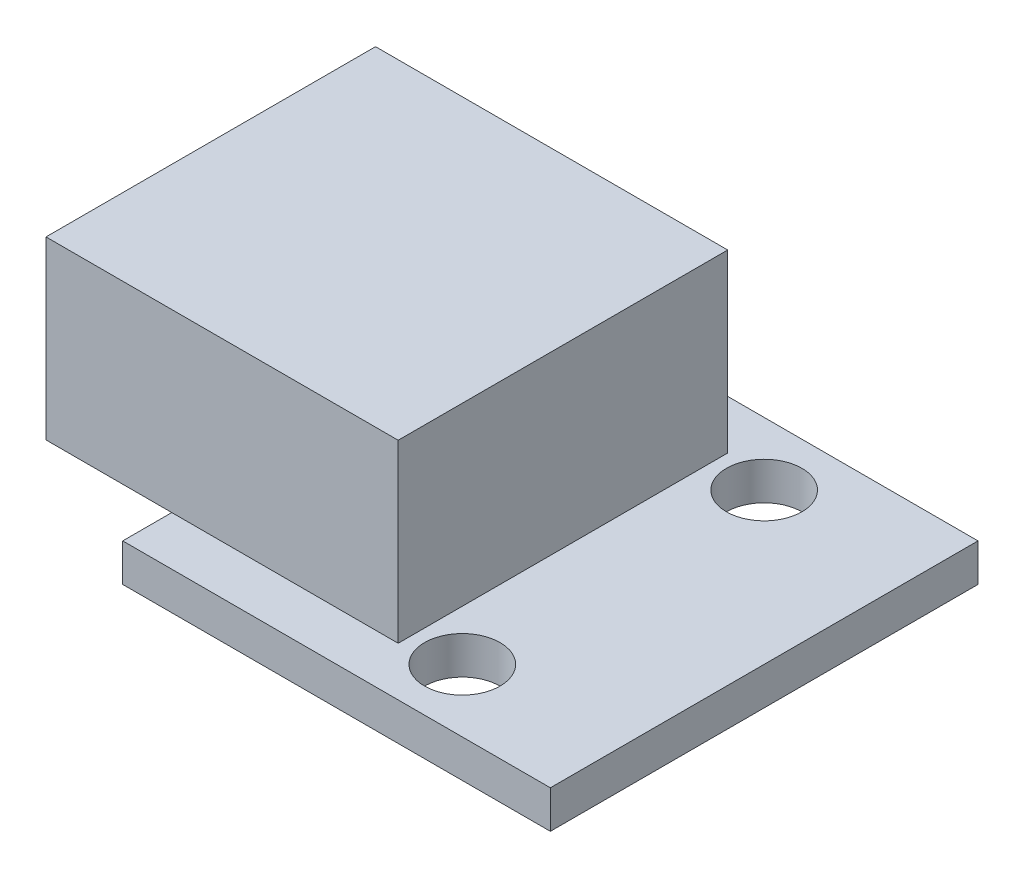
ISO-10303-21;
HEADER;
FILE_DESCRIPTION(('STEP AP214'),'2;1');
FILE_NAME('part.step','',(''),(''),'','','');
FILE_SCHEMA(('AUTOMOTIVE_DESIGN { 1 0 10303 214 1 1 1 1 }'));
ENDSEC;
DATA;
#1=APPLICATION_CONTEXT('core data for automotive mechanical design processes');
#2=APPLICATION_PROTOCOL_DEFINITION('international standard','automotive_design',2000,#1);
#3=PRODUCT_CONTEXT('',#1,'mechanical');
#4=PRODUCT('Part','Part','',(#3));
#5=PRODUCT_RELATED_PRODUCT_CATEGORY('part','',(#4));
#6=PRODUCT_DEFINITION_FORMATION('','',#4);
#7=PRODUCT_DEFINITION_CONTEXT('part definition',#1,'design');
#8=PRODUCT_DEFINITION('design','',#6,#7);
#9=PRODUCT_DEFINITION_SHAPE('','',#8);
#10=(LENGTH_UNIT() NAMED_UNIT(*) SI_UNIT(.MILLI.,.METRE.));
#11=(NAMED_UNIT(*) PLANE_ANGLE_UNIT() SI_UNIT($,.RADIAN.));
#12=(NAMED_UNIT(*) SI_UNIT($,.STERADIAN.) SOLID_ANGLE_UNIT());
#13=UNCERTAINTY_MEASURE_WITH_UNIT(LENGTH_MEASURE(1.E-05),#10,'distance_accuracy_value','');
#14=(GEOMETRIC_REPRESENTATION_CONTEXT(3) GLOBAL_UNCERTAINTY_ASSIGNED_CONTEXT((#13)) GLOBAL_UNIT_ASSIGNED_CONTEXT((#10,
#11,#12)) REPRESENTATION_CONTEXT('',''));
#15=CARTESIAN_POINT('',(0.,0.,0.));
#16=DIRECTION('',(0.,0.,1.));
#17=DIRECTION('',(1.,0.,0.));
#18=AXIS2_PLACEMENT_3D('',#15,#16,#17);
#19=CARTESIAN_POINT('',(0.,1.5,0.));
#20=DIRECTION('',(0.,-1.,0.));
#21=DIRECTION('',(0.,0.,-1.));
#22=AXIS2_PLACEMENT_3D('',#19,#20,#21);
#23=PLANE('',#22);
#24=CARTESIAN_POINT('',(2.5,1.5,6.));
#25=DIRECTION('',(0.,1.,0.));
#26=DIRECTION('',(0.,0.,1.));
#27=AXIS2_PLACEMENT_3D('',#24,#25,#26);
#28=CIRCLE('',#27,1.5);
#29=CARTESIAN_POINT('',(2.5,1.5,7.5));
#30=VERTEX_POINT('',#29);
#31=EDGE_CURVE('E126',#30,#30,#28,.T.);
#32=ORIENTED_EDGE('',*,*,#31,.F.);
#33=EDGE_LOOP('',(#32));
#34=FACE_BOUND('',#33,.T.);
#35=CARTESIAN_POINT('',(2.5,1.5,-6.));
#36=DIRECTION('',(0.,1.,0.));
#37=DIRECTION('',(0.,0.,1.));
#38=AXIS2_PLACEMENT_3D('',#35,#36,#37);
#39=CIRCLE('',#38,1.5);
#40=CARTESIAN_POINT('',(2.5,1.5,-4.5));
#41=VERTEX_POINT('',#40);
#42=EDGE_CURVE('E135',#41,#41,#39,.T.);
#43=ORIENTED_EDGE('',*,*,#42,.F.);
#44=EDGE_LOOP('',(#43));
#45=FACE_BOUND('',#44,.T.);
#46=DIRECTION('',(1.,0.,0.));
#47=VECTOR('',#46,1.);
#48=CARTESIAN_POINT('',(-13.5,1.5,6.55));
#49=LINE('',#48,#47);
#50=CARTESIAN_POINT('',(-8.5,1.5,6.55));
#51=VERTEX_POINT('',#50);
#52=CARTESIAN_POINT('',(0.500000000000002,1.5,6.55));
#53=VERTEX_POINT('',#52);
#54=EDGE_CURVE('E11',#51,#53,#49,.T.);
#55=ORIENTED_EDGE('',*,*,#54,.F.);
#56=DIRECTION('',(0.,0.,1.));
#57=VECTOR('',#56,1.);
#58=CARTESIAN_POINT('',(-8.5,1.5,8.5));
#59=LINE('',#58,#57);
#60=CARTESIAN_POINT('',(-8.5,1.5,8.5));
#61=VERTEX_POINT('',#60);
#62=EDGE_CURVE('E147',#51,#61,#59,.T.);
#63=ORIENTED_EDGE('',*,*,#62,.T.);
#64=DIRECTION('',(1.,0.,0.));
#65=VECTOR('',#64,1.);
#66=CARTESIAN_POINT('',(-8.5,1.5,8.5));
#67=LINE('',#66,#65);
#68=CARTESIAN_POINT('',(8.5,1.5,8.5));
#69=VERTEX_POINT('',#68);
#70=EDGE_CURVE('E150',#61,#69,#67,.T.);
#71=ORIENTED_EDGE('',*,*,#70,.T.);
#72=DIRECTION('',(0.,0.,-1.));
#73=VECTOR('',#72,1.);
#74=CARTESIAN_POINT('',(8.5,1.5,8.5));
#75=LINE('',#74,#73);
#76=CARTESIAN_POINT('',(8.5,1.5,-8.5));
#77=VERTEX_POINT('',#76);
#78=EDGE_CURVE('E141',#69,#77,#75,.T.);
#79=ORIENTED_EDGE('',*,*,#78,.T.);
#80=DIRECTION('',(-1.,0.,0.));
#81=VECTOR('',#80,1.);
#82=CARTESIAN_POINT('',(-8.5,1.5,-8.5));
#83=LINE('',#82,#81);
#84=CARTESIAN_POINT('',(-8.5,1.5,-8.5));
#85=VERTEX_POINT('',#84);
#86=EDGE_CURVE('E144',#77,#85,#83,.T.);
#87=ORIENTED_EDGE('',*,*,#86,.T.);
#88=CARTESIAN_POINT('',(-8.5,1.5,-6.55));
#89=VERTEX_POINT('',#88);
#90=EDGE_CURVE('E148',#85,#89,#59,.T.);
#91=ORIENTED_EDGE('',*,*,#90,.T.);
#92=DIRECTION('',(-1.,0.,0.));
#93=VECTOR('',#92,1.);
#94=CARTESIAN_POINT('',(-13.5,1.5,-6.55));
#95=LINE('',#94,#93);
#96=CARTESIAN_POINT('',(0.500000000000002,1.5,-6.55));
#97=VERTEX_POINT('',#96);
#98=EDGE_CURVE('E53',#97,#89,#95,.T.);
#99=ORIENTED_EDGE('',*,*,#98,.F.);
#100=DIRECTION('',(0.,0.,-1.));
#101=VECTOR('',#100,1.);
#102=CARTESIAN_POINT('',(0.500000000000002,1.5,6.55));
#103=LINE('',#102,#101);
#104=EDGE_CURVE('E49',#53,#97,#103,.T.);
#105=ORIENTED_EDGE('',*,*,#104,.F.);
#106=EDGE_LOOP('',(#55,#63,#71,#79,#87,#91,#99,#105));
#107=FACE_BOUND('',#106,.T.);
#108=ADVANCED_FACE('F32',(#34,#45,#107),#23,.F.);
#109=CARTESIAN_POINT('',(0.,0.,0.));
#110=DIRECTION('',(0.,-1.,0.));
#111=DIRECTION('',(0.,0.,-1.));
#112=AXIS2_PLACEMENT_3D('',#109,#110,#111);
#113=PLANE('',#112);
#114=CARTESIAN_POINT('',(2.5,0.,-6.));
#115=DIRECTION('',(0.,1.,0.));
#116=DIRECTION('',(0.,0.,1.));
#117=AXIS2_PLACEMENT_3D('',#114,#115,#116);
#118=CIRCLE('',#117,1.5);
#119=CARTESIAN_POINT('',(2.5,0.,-4.5));
#120=VERTEX_POINT('',#119);
#121=EDGE_CURVE('E133',#120,#120,#118,.T.);
#122=ORIENTED_EDGE('',*,*,#121,.T.);
#123=EDGE_LOOP('',(#122));
#124=FACE_BOUND('',#123,.T.);
#125=DIRECTION('',(0.,0.,-1.));
#126=VECTOR('',#125,1.);
#127=CARTESIAN_POINT('',(8.5,0.,8.5));
#128=LINE('',#127,#126);
#129=CARTESIAN_POINT('',(8.5,0.,8.5));
#130=VERTEX_POINT('',#129);
#131=CARTESIAN_POINT('',(8.5,0.,-8.5));
#132=VERTEX_POINT('',#131);
#133=EDGE_CURVE('E138',#130,#132,#128,.T.);
#134=ORIENTED_EDGE('',*,*,#133,.F.);
#135=DIRECTION('',(1.,0.,0.));
#136=VECTOR('',#135,1.);
#137=CARTESIAN_POINT('',(-8.5,0.,8.5));
#138=LINE('',#137,#136);
#139=CARTESIAN_POINT('',(-8.5,0.,8.5));
#140=VERTEX_POINT('',#139);
#141=EDGE_CURVE('E145',#140,#130,#138,.T.);
#142=ORIENTED_EDGE('',*,*,#141,.F.);
#143=DIRECTION('',(0.,0.,1.));
#144=VECTOR('',#143,1.);
#145=CARTESIAN_POINT('',(-8.5,0.,8.5));
#146=LINE('',#145,#144);
#147=CARTESIAN_POINT('',(-8.5,0.,-8.5));
#148=VERTEX_POINT('',#147);
#149=EDGE_CURVE('E158',#148,#140,#146,.T.);
#150=ORIENTED_EDGE('',*,*,#149,.F.);
#151=DIRECTION('',(-1.,0.,0.));
#152=VECTOR('',#151,1.);
#153=CARTESIAN_POINT('',(-8.5,0.,-8.5));
#154=LINE('',#153,#152);
#155=EDGE_CURVE('E156',#132,#148,#154,.T.);
#156=ORIENTED_EDGE('',*,*,#155,.F.);
#157=EDGE_LOOP('',(#134,#142,#150,#156));
#158=FACE_BOUND('',#157,.T.);
#159=CARTESIAN_POINT('',(2.5,0.,6.));
#160=DIRECTION('',(0.,1.,0.));
#161=DIRECTION('',(0.,0.,1.));
#162=AXIS2_PLACEMENT_3D('',#159,#160,#161);
#163=CIRCLE('',#162,1.5);
#164=CARTESIAN_POINT('',(2.5,0.,7.5));
#165=VERTEX_POINT('',#164);
#166=EDGE_CURVE('E123',#165,#165,#163,.T.);
#167=ORIENTED_EDGE('',*,*,#166,.T.);
#168=EDGE_LOOP('',(#167));
#169=FACE_BOUND('',#168,.T.);
#170=ADVANCED_FACE('F181',(#124,#158,#169),#113,.T.);
#171=CARTESIAN_POINT('',(8.5,1.5,8.5));
#172=DIRECTION('',(-1.,0.,0.));
#173=DIRECTION('',(0.,0.,1.));
#174=AXIS2_PLACEMENT_3D('',#171,#172,#173);
#175=PLANE('',#174);
#176=ORIENTED_EDGE('',*,*,#133,.T.);
#177=DIRECTION('',(0.,-1.,0.));
#178=VECTOR('',#177,1.);
#179=CARTESIAN_POINT('',(8.5,1.5,-8.5));
#180=LINE('',#179,#178);
#181=EDGE_CURVE('E36',#77,#132,#180,.T.);
#182=ORIENTED_EDGE('',*,*,#181,.F.);
#183=ORIENTED_EDGE('',*,*,#78,.F.);
#184=DIRECTION('',(0.,-1.,0.));
#185=VECTOR('',#184,1.);
#186=CARTESIAN_POINT('',(8.5,1.5,8.5));
#187=LINE('',#186,#185);
#188=EDGE_CURVE('E153',#69,#130,#187,.T.);
#189=ORIENTED_EDGE('',*,*,#188,.T.);
#190=EDGE_LOOP('',(#176,#182,#183,#189));
#191=FACE_BOUND('',#190,.T.);
#192=ADVANCED_FACE('F34',(#191),#175,.F.);
#193=CARTESIAN_POINT('',(-8.5,1.5,-8.5));
#194=DIRECTION('',(0.,0.,1.));
#195=DIRECTION('',(1.,0.,0.));
#196=AXIS2_PLACEMENT_3D('',#193,#194,#195);
#197=PLANE('',#196);
#198=ORIENTED_EDGE('',*,*,#155,.T.);
#199=DIRECTION('',(0.,-1.,0.));
#200=VECTOR('',#199,1.);
#201=CARTESIAN_POINT('',(-8.5,1.5,-8.5));
#202=LINE('',#201,#200);
#203=EDGE_CURVE('E165',#85,#148,#202,.T.);
#204=ORIENTED_EDGE('',*,*,#203,.F.);
#205=ORIENTED_EDGE('',*,*,#86,.F.);
#206=ORIENTED_EDGE('',*,*,#181,.T.);
#207=EDGE_LOOP('',(#198,#204,#205,#206));
#208=FACE_BOUND('',#207,.T.);
#209=ADVANCED_FACE('F174',(#208),#197,.F.);
#210=CARTESIAN_POINT('',(-8.5,1.5,8.5));
#211=DIRECTION('',(1.,0.,0.));
#212=DIRECTION('',(0.,0.,-1.));
#213=AXIS2_PLACEMENT_3D('',#210,#211,#212);
#214=PLANE('',#213);
#215=ORIENTED_EDGE('',*,*,#149,.T.);
#216=DIRECTION('',(0.,-1.,0.));
#217=VECTOR('',#216,1.);
#218=CARTESIAN_POINT('',(-8.5,1.5,8.5));
#219=LINE('',#218,#217);
#220=EDGE_CURVE('E163',#61,#140,#219,.T.);
#221=ORIENTED_EDGE('',*,*,#220,.F.);
#222=ORIENTED_EDGE('',*,*,#62,.F.);
#223=EDGE_CURVE('E151',#89,#51,#59,.T.);
#224=ORIENTED_EDGE('',*,*,#223,.F.);
#225=ORIENTED_EDGE('',*,*,#90,.F.);
#226=ORIENTED_EDGE('',*,*,#203,.T.);
#227=EDGE_LOOP('',(#215,#221,#222,#224,#225,#226));
#228=FACE_BOUND('',#227,.T.);
#229=ADVANCED_FACE('F184',(#228),#214,.F.);
#230=CARTESIAN_POINT('',(-8.5,1.5,8.5));
#231=DIRECTION('',(0.,0.,-1.));
#232=DIRECTION('',(-1.,0.,0.));
#233=AXIS2_PLACEMENT_3D('',#230,#231,#232);
#234=PLANE('',#233);
#235=ORIENTED_EDGE('',*,*,#141,.T.);
#236=ORIENTED_EDGE('',*,*,#188,.F.);
#237=ORIENTED_EDGE('',*,*,#70,.F.);
#238=ORIENTED_EDGE('',*,*,#220,.T.);
#239=EDGE_LOOP('',(#235,#236,#237,#238));
#240=FACE_BOUND('',#239,.T.);
#241=ADVANCED_FACE('F188',(#240),#234,.F.);
#242=CARTESIAN_POINT('',(2.5,1.5,-6.));
#243=DIRECTION('',(0.,-1.,0.));
#244=DIRECTION('',(0.,0.,-1.));
#245=AXIS2_PLACEMENT_3D('',#242,#243,#244);
#246=CYLINDRICAL_SURFACE('',#245,1.5);
#247=ORIENTED_EDGE('',*,*,#42,.T.);
#248=EDGE_LOOP('',(#247));
#249=FACE_BOUND('',#248,.T.);
#250=ORIENTED_EDGE('',*,*,#121,.F.);
#251=EDGE_LOOP('',(#250));
#252=FACE_BOUND('',#251,.T.);
#253=ADVANCED_FACE('F231',(#249,#252),#246,.F.);
#254=CARTESIAN_POINT('',(2.5,1.5,6.));
#255=DIRECTION('',(0.,-1.,0.));
#256=DIRECTION('',(0.,0.,-1.));
#257=AXIS2_PLACEMENT_3D('',#254,#255,#256);
#258=CYLINDRICAL_SURFACE('',#257,1.5);
#259=ORIENTED_EDGE('',*,*,#31,.T.);
#260=EDGE_LOOP('',(#259));
#261=FACE_BOUND('',#260,.T.);
#262=ORIENTED_EDGE('',*,*,#166,.F.);
#263=EDGE_LOOP('',(#262));
#264=FACE_BOUND('',#263,.T.);
#265=ADVANCED_FACE('F274',(#261,#264),#258,.F.);
#266=CARTESIAN_POINT('',(0.500000000000002,8.49,6.55));
#267=DIRECTION('',(-1.,0.,0.));
#268=DIRECTION('',(0.,0.,1.));
#269=AXIS2_PLACEMENT_3D('',#266,#267,#268);
#270=PLANE('',#269);
#271=ORIENTED_EDGE('',*,*,#104,.T.);
#272=DIRECTION('',(0.,-1.,0.));
#273=VECTOR('',#272,1.);
#274=CARTESIAN_POINT('',(0.500000000000002,8.49,-6.55));
#275=LINE('',#274,#273);
#276=CARTESIAN_POINT('',(0.500000000000002,8.49,-6.55));
#277=VERTEX_POINT('',#276);
#278=EDGE_CURVE('E106',#277,#97,#275,.T.);
#279=ORIENTED_EDGE('',*,*,#278,.F.);
#280=DIRECTION('',(0.,0.,-1.));
#281=VECTOR('',#280,1.);
#282=CARTESIAN_POINT('',(0.500000000000002,8.49,6.55));
#283=LINE('',#282,#281);
#284=CARTESIAN_POINT('',(0.500000000000002,8.49,6.55));
#285=VERTEX_POINT('',#284);
#286=EDGE_CURVE('E112',#285,#277,#283,.T.);
#287=ORIENTED_EDGE('',*,*,#286,.F.);
#288=DIRECTION('',(0.,-1.,0.));
#289=VECTOR('',#288,1.);
#290=CARTESIAN_POINT('',(0.500000000000002,8.49,6.55));
#291=LINE('',#290,#289);
#292=EDGE_CURVE('E206',#285,#53,#291,.T.);
#293=ORIENTED_EDGE('',*,*,#292,.T.);
#294=EDGE_LOOP('',(#271,#279,#287,#293));
#295=FACE_BOUND('',#294,.T.);
#296=ADVANCED_FACE('F122',(#295),#270,.F.);
#297=CARTESIAN_POINT('',(-13.5,8.49,-6.55));
#298=DIRECTION('',(0.,0.,1.));
#299=DIRECTION('',(1.,0.,0.));
#300=AXIS2_PLACEMENT_3D('',#297,#298,#299);
#301=PLANE('',#300);
#302=ORIENTED_EDGE('',*,*,#98,.T.);
#303=CARTESIAN_POINT('',(-13.5,1.5,-6.55));
#304=VERTEX_POINT('',#303);
#305=EDGE_CURVE('E197',#89,#304,#95,.T.);
#306=ORIENTED_EDGE('',*,*,#305,.T.);
#307=DIRECTION('',(0.,-1.,0.));
#308=VECTOR('',#307,1.);
#309=CARTESIAN_POINT('',(-13.5,8.49,-6.55));
#310=LINE('',#309,#308);
#311=CARTESIAN_POINT('',(-13.5,8.49,-6.55));
#312=VERTEX_POINT('',#311);
#313=EDGE_CURVE('E108',#312,#304,#310,.T.);
#314=ORIENTED_EDGE('',*,*,#313,.F.);
#315=DIRECTION('',(-1.,0.,0.));
#316=VECTOR('',#315,1.);
#317=CARTESIAN_POINT('',(-13.5,8.49,-6.55));
#318=LINE('',#317,#316);
#319=EDGE_CURVE('E102',#277,#312,#318,.T.);
#320=ORIENTED_EDGE('',*,*,#319,.F.);
#321=ORIENTED_EDGE('',*,*,#278,.T.);
#322=EDGE_LOOP('',(#302,#306,#314,#320,#321));
#323=FACE_BOUND('',#322,.T.);
#324=ADVANCED_FACE('F104',(#323),#301,.F.);
#325=CARTESIAN_POINT('',(-13.5,8.49,6.55));
#326=DIRECTION('',(1.,0.,0.));
#327=DIRECTION('',(0.,0.,-1.));
#328=AXIS2_PLACEMENT_3D('',#325,#326,#327);
#329=PLANE('',#328);
#330=DIRECTION('',(0.,0.,1.));
#331=VECTOR('',#330,1.);
#332=CARTESIAN_POINT('',(-13.5,1.5,6.55));
#333=LINE('',#332,#331);
#334=CARTESIAN_POINT('',(-13.5,1.5,6.55));
#335=VERTEX_POINT('',#334);
#336=EDGE_CURVE('E202',#304,#335,#333,.T.);
#337=ORIENTED_EDGE('',*,*,#336,.T.);
#338=DIRECTION('',(0.,-1.,0.));
#339=VECTOR('',#338,1.);
#340=CARTESIAN_POINT('',(-13.5,8.49,6.55));
#341=LINE('',#340,#339);
#342=CARTESIAN_POINT('',(-13.5,8.49,6.55));
#343=VERTEX_POINT('',#342);
#344=EDGE_CURVE('E128',#343,#335,#341,.T.);
#345=ORIENTED_EDGE('',*,*,#344,.F.);
#346=DIRECTION('',(0.,0.,1.));
#347=VECTOR('',#346,1.);
#348=CARTESIAN_POINT('',(-13.5,8.49,6.55));
#349=LINE('',#348,#347);
#350=EDGE_CURVE('E111',#312,#343,#349,.T.);
#351=ORIENTED_EDGE('',*,*,#350,.F.);
#352=ORIENTED_EDGE('',*,*,#313,.T.);
#353=EDGE_LOOP('',(#337,#345,#351,#352));
#354=FACE_BOUND('',#353,.T.);
#355=ADVANCED_FACE('F211',(#354),#329,.F.);
#356=CARTESIAN_POINT('',(-13.5,8.49,6.55));
#357=DIRECTION('',(0.,0.,-1.));
#358=DIRECTION('',(-1.,0.,0.));
#359=AXIS2_PLACEMENT_3D('',#356,#357,#358);
#360=PLANE('',#359);
#361=EDGE_CURVE('E42',#335,#51,#49,.T.);
#362=ORIENTED_EDGE('',*,*,#361,.T.);
#363=ORIENTED_EDGE('',*,*,#54,.T.);
#364=ORIENTED_EDGE('',*,*,#292,.F.);
#365=DIRECTION('',(1.,0.,0.));
#366=VECTOR('',#365,1.);
#367=CARTESIAN_POINT('',(-13.5,8.49,6.55));
#368=LINE('',#367,#366);
#369=EDGE_CURVE('E117',#343,#285,#368,.T.);
#370=ORIENTED_EDGE('',*,*,#369,.F.);
#371=ORIENTED_EDGE('',*,*,#344,.T.);
#372=EDGE_LOOP('',(#362,#363,#364,#370,#371));
#373=FACE_BOUND('',#372,.T.);
#374=ADVANCED_FACE('F200',(#373),#360,.F.);
#375=CARTESIAN_POINT('',(0.,8.49,0.));
#376=DIRECTION('',(0.,-1.,0.));
#377=DIRECTION('',(0.,0.,-1.));
#378=AXIS2_PLACEMENT_3D('',#375,#376,#377);
#379=PLANE('',#378);
#380=ORIENTED_EDGE('',*,*,#286,.T.);
#381=ORIENTED_EDGE('',*,*,#319,.T.);
#382=ORIENTED_EDGE('',*,*,#350,.T.);
#383=ORIENTED_EDGE('',*,*,#369,.T.);
#384=EDGE_LOOP('',(#380,#381,#382,#383));
#385=FACE_BOUND('',#384,.T.);
#386=ADVANCED_FACE('F115',(#385),#379,.F.);
#387=CARTESIAN_POINT('',(0.,1.5,0.));
#388=DIRECTION('',(0.,-1.,0.));
#389=DIRECTION('',(0.,0.,-1.));
#390=AXIS2_PLACEMENT_3D('',#387,#388,#389);
#391=PLANE('',#390);
#392=ORIENTED_EDGE('',*,*,#305,.F.);
#393=ORIENTED_EDGE('',*,*,#223,.T.);
#394=ORIENTED_EDGE('',*,*,#361,.F.);
#395=ORIENTED_EDGE('',*,*,#336,.F.);
#396=EDGE_LOOP('',(#392,#393,#394,#395));
#397=FACE_BOUND('',#396,.T.);
#398=ADVANCED_FACE('F195',(#397),#391,.T.);
#399=CLOSED_SHELL('',(#108,#170,#192,#209,#229,#241,#253,#265,#296,#324,#355,#374,#386,#398));
#400=MANIFOLD_SOLID_BREP('B2',#399);
#401=ADVANCED_BREP_SHAPE_REPRESENTATION('',(#18,#400),#14);
#402=SHAPE_DEFINITION_REPRESENTATION(#9,#401);
ENDSEC;
END-ISO-10303-21;
